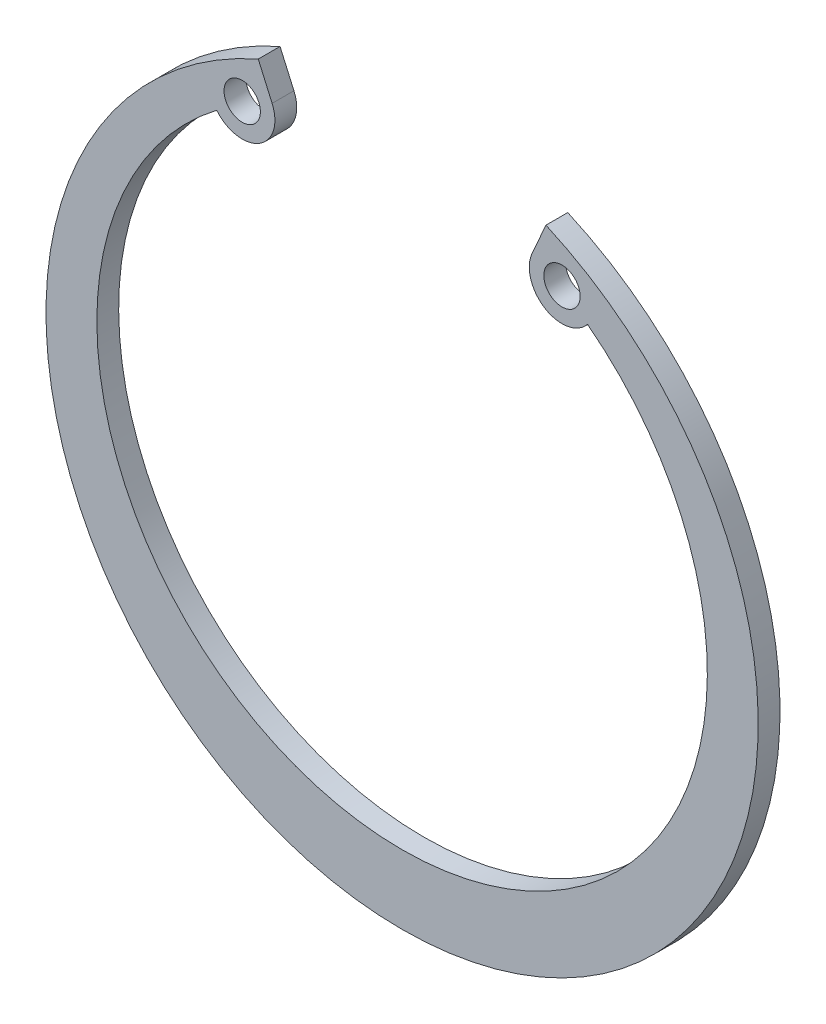
ISO-10303-21;
HEADER;
FILE_DESCRIPTION(('STEP AP214'),'2;1');
FILE_NAME('part.step','',(''),(''),'','','');
FILE_SCHEMA(('AUTOMOTIVE_DESIGN { 1 0 10303 214 1 1 1 1 }'));
ENDSEC;
DATA;
#1=APPLICATION_CONTEXT('core data for automotive mechanical design processes');
#2=APPLICATION_PROTOCOL_DEFINITION('international standard','automotive_design',2000,#1);
#3=PRODUCT_CONTEXT('',#1,'mechanical');
#4=PRODUCT('Part','Part','',(#3));
#5=PRODUCT_RELATED_PRODUCT_CATEGORY('part','',(#4));
#6=PRODUCT_DEFINITION_FORMATION('','',#4);
#7=PRODUCT_DEFINITION_CONTEXT('part definition',#1,'design');
#8=PRODUCT_DEFINITION('design','',#6,#7);
#9=PRODUCT_DEFINITION_SHAPE('','',#8);
#10=(LENGTH_UNIT() NAMED_UNIT(*) SI_UNIT(.MILLI.,.METRE.));
#11=(NAMED_UNIT(*) PLANE_ANGLE_UNIT() SI_UNIT($,.RADIAN.));
#12=(NAMED_UNIT(*) SI_UNIT($,.STERADIAN.) SOLID_ANGLE_UNIT());
#13=UNCERTAINTY_MEASURE_WITH_UNIT(LENGTH_MEASURE(1.E-05),#10,'distance_accuracy_value','');
#14=(GEOMETRIC_REPRESENTATION_CONTEXT(3) GLOBAL_UNCERTAINTY_ASSIGNED_CONTEXT((#13)) GLOBAL_UNIT_ASSIGNED_CONTEXT((#10,
#11,#12)) REPRESENTATION_CONTEXT('',''));
#15=CARTESIAN_POINT('',(0.,0.,0.));
#16=DIRECTION('',(0.,0.,1.));
#17=DIRECTION('',(1.,0.,0.));
#18=AXIS2_PLACEMENT_3D('',#15,#16,#17);
#19=CARTESIAN_POINT('',(-11.,19.3406954373414,1.5));
#20=DIRECTION('',(0.,0.,-1.));
#21=DIRECTION('',(-1.,0.,0.));
#22=AXIS2_PLACEMENT_3D('',#19,#20,#21);
#23=PLANE('',#22);
#24=CARTESIAN_POINT('',(11.,19.3406954373414,1.5));
#25=DIRECTION('',(0.,0.,1.));
#26=DIRECTION('',(1.,0.,0.));
#27=AXIS2_PLACEMENT_3D('',#24,#25,#26);
#28=CIRCLE('',#27,1.25);
#29=CARTESIAN_POINT('',(12.25,19.3406954373414,1.5));
#30=VERTEX_POINT('',#29);
#31=EDGE_CURVE('E422',#30,#30,#28,.T.);
#32=ORIENTED_EDGE('',*,*,#31,.F.);
#33=EDGE_LOOP('',(#32));
#34=FACE_BOUND('',#33,.T.);
#35=CARTESIAN_POINT('',(-11.,19.3406954373414,1.5));
#36=DIRECTION('',(0.,0.,1.));
#37=DIRECTION('',(-1.,0.,0.));
#38=AXIS2_PLACEMENT_3D('',#35,#36,#37);
#39=CIRCLE('',#38,2.25);
#40=CARTESIAN_POINT('',(-12.7549668879333,17.9326502597077,1.5));
#41=VERTEX_POINT('',#40);
#42=CARTESIAN_POINT('',(-8.94173922779528,20.2495752938699,1.5));
#43=VERTEX_POINT('',#42);
#44=EDGE_CURVE('E436',#41,#43,#39,.T.);
#45=ORIENTED_EDGE('',*,*,#44,.T.);
#46=DIRECTION('',(-0.403946602901547,0.91478256542432,0.));
#47=VECTOR('',#46,1.);
#48=CARTESIAN_POINT('',(-8.94173922779528,20.2495752938699,1.5));
#49=LINE('',#48,#47);
#50=CARTESIAN_POINT('',(-9.89669177108789,22.4121728528958,1.5));
#51=VERTEX_POINT('',#50);
#52=EDGE_CURVE('E417',#43,#51,#49,.T.);
#53=ORIENTED_EDGE('',*,*,#52,.T.);
#54=CARTESIAN_POINT('',(0.,0.,1.5));
#55=DIRECTION('',(0.,0.,1.));
#56=DIRECTION('',(1.,0.,0.));
#57=AXIS2_PLACEMENT_3D('',#54,#55,#56);
#58=CIRCLE('',#57,24.5);
#59=CARTESIAN_POINT('',(9.89669177108789,22.4121728528958,1.5));
#60=VERTEX_POINT('',#59);
#61=EDGE_CURVE('E439',#51,#60,#58,.T.);
#62=ORIENTED_EDGE('',*,*,#61,.T.);
#63=DIRECTION('',(-0.403946602901547,-0.91478256542432,0.));
#64=VECTOR('',#63,1.);
#65=CARTESIAN_POINT('',(8.94173922779528,20.2495752938699,1.5));
#66=LINE('',#65,#64);
#67=CARTESIAN_POINT('',(8.94173922779528,20.2495752938699,1.5));
#68=VERTEX_POINT('',#67);
#69=EDGE_CURVE('E441',#60,#68,#66,.T.);
#70=ORIENTED_EDGE('',*,*,#69,.T.);
#71=CARTESIAN_POINT('',(11.,19.3406954373414,1.5));
#72=DIRECTION('',(0.,0.,1.));
#73=DIRECTION('',(1.,0.,0.));
#74=AXIS2_PLACEMENT_3D('',#71,#72,#73);
#75=CIRCLE('',#74,2.25);
#76=CARTESIAN_POINT('',(12.7549668879333,17.9326502597077,1.5));
#77=VERTEX_POINT('',#76);
#78=EDGE_CURVE('E370',#68,#77,#75,.T.);
#79=ORIENTED_EDGE('',*,*,#78,.T.);
#80=CARTESIAN_POINT('',(0.,1.25,1.5));
#81=DIRECTION('',(0.,0.,-1.));
#82=DIRECTION('',(1.,0.,0.));
#83=AXIS2_PLACEMENT_3D('',#80,#81,#82);
#84=CIRCLE('',#83,21.);
#85=EDGE_CURVE('E365',#77,#41,#84,.T.);
#86=ORIENTED_EDGE('',*,*,#85,.T.);
#87=EDGE_LOOP('',(#45,#53,#62,#70,#79,#86));
#88=FACE_BOUND('',#87,.T.);
#89=CARTESIAN_POINT('',(-11.,19.3406954373414,1.5));
#90=DIRECTION('',(0.,0.,1.));
#91=DIRECTION('',(-1.,0.,0.));
#92=AXIS2_PLACEMENT_3D('',#89,#90,#91);
#93=CIRCLE('',#92,1.25);
#94=CARTESIAN_POINT('',(-12.25,19.3406954373414,1.5));
#95=VERTEX_POINT('',#94);
#96=EDGE_CURVE('E496',#95,#95,#93,.T.);
#97=ORIENTED_EDGE('',*,*,#96,.F.);
#98=EDGE_LOOP('',(#97));
#99=FACE_BOUND('',#98,.T.);
#100=ADVANCED_FACE('F350',(#34,#88,#99),#23,.F.);
#101=CARTESIAN_POINT('',(-11.,19.3406954373414,0.));
#102=DIRECTION('',(0.,0.,-1.));
#103=DIRECTION('',(-1.,0.,0.));
#104=AXIS2_PLACEMENT_3D('',#101,#102,#103);
#105=PLANE('',#104);
#106=CARTESIAN_POINT('',(11.,19.3406954373414,0.));
#107=DIRECTION('',(0.,0.,1.));
#108=DIRECTION('',(1.,0.,0.));
#109=AXIS2_PLACEMENT_3D('',#106,#107,#108);
#110=CIRCLE('',#109,1.25);
#111=CARTESIAN_POINT('',(12.25,19.3406954373414,0.));
#112=VERTEX_POINT('',#111);
#113=EDGE_CURVE('E425',#112,#112,#110,.T.);
#114=ORIENTED_EDGE('',*,*,#113,.T.);
#115=EDGE_LOOP('',(#114));
#116=FACE_BOUND('',#115,.T.);
#117=CARTESIAN_POINT('',(-11.,19.3406954373414,0.));
#118=DIRECTION('',(0.,0.,1.));
#119=DIRECTION('',(-1.,0.,0.));
#120=AXIS2_PLACEMENT_3D('',#117,#118,#119);
#121=CIRCLE('',#120,2.25);
#122=CARTESIAN_POINT('',(-12.7549668879333,17.9326502597077,0.));
#123=VERTEX_POINT('',#122);
#124=CARTESIAN_POINT('',(-8.94173922779528,20.2495752938699,0.));
#125=VERTEX_POINT('',#124);
#126=EDGE_CURVE('E408',#123,#125,#121,.T.);
#127=ORIENTED_EDGE('',*,*,#126,.F.);
#128=CARTESIAN_POINT('',(0.,1.25,0.));
#129=DIRECTION('',(0.,0.,-1.));
#130=DIRECTION('',(1.,0.,0.));
#131=AXIS2_PLACEMENT_3D('',#128,#129,#130);
#132=CIRCLE('',#131,21.);
#133=CARTESIAN_POINT('',(12.7549668879333,17.9326502597077,0.));
#134=VERTEX_POINT('',#133);
#135=EDGE_CURVE('E434',#134,#123,#132,.T.);
#136=ORIENTED_EDGE('',*,*,#135,.F.);
#137=CARTESIAN_POINT('',(11.,19.3406954373414,0.));
#138=DIRECTION('',(0.,0.,1.));
#139=DIRECTION('',(1.,0.,0.));
#140=AXIS2_PLACEMENT_3D('',#137,#138,#139);
#141=CIRCLE('',#140,2.25);
#142=CARTESIAN_POINT('',(8.94173922779528,20.2495752938699,0.));
#143=VERTEX_POINT('',#142);
#144=EDGE_CURVE('E432',#143,#134,#141,.T.);
#145=ORIENTED_EDGE('',*,*,#144,.F.);
#146=DIRECTION('',(-0.403946602901547,-0.91478256542432,0.));
#147=VECTOR('',#146,1.);
#148=CARTESIAN_POINT('',(8.94173922779528,20.2495752938699,0.));
#149=LINE('',#148,#147);
#150=CARTESIAN_POINT('',(9.89669177108789,22.4121728528958,0.));
#151=VERTEX_POINT('',#150);
#152=EDGE_CURVE('E430',#151,#143,#149,.T.);
#153=ORIENTED_EDGE('',*,*,#152,.F.);
#154=CARTESIAN_POINT('',(0.,0.,0.));
#155=DIRECTION('',(0.,0.,1.));
#156=DIRECTION('',(1.,0.,0.));
#157=AXIS2_PLACEMENT_3D('',#154,#155,#156);
#158=CIRCLE('',#157,24.5);
#159=CARTESIAN_POINT('',(-9.89669177108789,22.4121728528958,0.));
#160=VERTEX_POINT('',#159);
#161=EDGE_CURVE('E410',#160,#151,#158,.T.);
#162=ORIENTED_EDGE('',*,*,#161,.F.);
#163=DIRECTION('',(-0.403946602901547,0.91478256542432,0.));
#164=VECTOR('',#163,1.);
#165=CARTESIAN_POINT('',(-8.94173922779528,20.2495752938699,0.));
#166=LINE('',#165,#164);
#167=EDGE_CURVE('E403',#125,#160,#166,.T.);
#168=ORIENTED_EDGE('',*,*,#167,.F.);
#169=EDGE_LOOP('',(#127,#136,#145,#153,#162,#168));
#170=FACE_BOUND('',#169,.T.);
#171=CARTESIAN_POINT('',(-11.,19.3406954373414,0.));
#172=DIRECTION('',(0.,0.,1.));
#173=DIRECTION('',(-1.,0.,0.));
#174=AXIS2_PLACEMENT_3D('',#171,#172,#173);
#175=CIRCLE('',#174,1.25);
#176=CARTESIAN_POINT('',(-12.25,19.3406954373414,0.));
#177=VERTEX_POINT('',#176);
#178=EDGE_CURVE('E499',#177,#177,#175,.T.);
#179=ORIENTED_EDGE('',*,*,#178,.T.);
#180=EDGE_LOOP('',(#179));
#181=FACE_BOUND('',#180,.T.);
#182=ADVANCED_FACE('F404',(#116,#170,#181),#105,.T.);
#183=CARTESIAN_POINT('',(-11.,19.3406954373414,1.5));
#184=DIRECTION('',(0.,0.,-1.));
#185=DIRECTION('',(-1.,0.,0.));
#186=AXIS2_PLACEMENT_3D('',#183,#184,#185);
#187=CYLINDRICAL_SURFACE('',#186,2.25);
#188=ORIENTED_EDGE('',*,*,#126,.T.);
#189=DIRECTION('',(0.,0.,-1.));
#190=VECTOR('',#189,1.);
#191=CARTESIAN_POINT('',(-8.94173922779528,20.2495752938699,1.5));
#192=LINE('',#191,#190);
#193=EDGE_CURVE('E11',#43,#125,#192,.T.);
#194=ORIENTED_EDGE('',*,*,#193,.F.);
#195=ORIENTED_EDGE('',*,*,#44,.F.);
#196=DIRECTION('',(0.,0.,-1.));
#197=VECTOR('',#196,1.);
#198=CARTESIAN_POINT('',(-12.7549668879333,17.9326502597077,1.5));
#199=LINE('',#198,#197);
#200=EDGE_CURVE('E421',#41,#123,#199,.T.);
#201=ORIENTED_EDGE('',*,*,#200,.T.);
#202=EDGE_LOOP('',(#188,#194,#195,#201));
#203=FACE_BOUND('',#202,.T.);
#204=ADVANCED_FACE('F352',(#203),#187,.T.);
#205=CARTESIAN_POINT('',(-8.94173922779528,20.2495752938699,1.5));
#206=DIRECTION('',(-0.91478256542432,-0.403946602901547,0.));
#207=DIRECTION('',(0.403946602901547,-0.91478256542432,0.));
#208=AXIS2_PLACEMENT_3D('',#205,#206,#207);
#209=PLANE('',#208);
#210=ORIENTED_EDGE('',*,*,#167,.T.);
#211=DIRECTION('',(0.,0.,-1.));
#212=VECTOR('',#211,1.);
#213=CARTESIAN_POINT('',(-9.89669177108789,22.4121728528958,1.5));
#214=LINE('',#213,#212);
#215=EDGE_CURVE('E358',#51,#160,#214,.T.);
#216=ORIENTED_EDGE('',*,*,#215,.F.);
#217=ORIENTED_EDGE('',*,*,#52,.F.);
#218=ORIENTED_EDGE('',*,*,#193,.T.);
#219=EDGE_LOOP('',(#210,#216,#217,#218));
#220=FACE_BOUND('',#219,.T.);
#221=ADVANCED_FACE('F416',(#220),#209,.F.);
#222=CARTESIAN_POINT('',(0.,0.,1.5));
#223=DIRECTION('',(0.,0.,-1.));
#224=DIRECTION('',(-1.,0.,0.));
#225=AXIS2_PLACEMENT_3D('',#222,#223,#224);
#226=CYLINDRICAL_SURFACE('',#225,24.5);
#227=ORIENTED_EDGE('',*,*,#161,.T.);
#228=DIRECTION('',(0.,0.,-1.));
#229=VECTOR('',#228,1.);
#230=CARTESIAN_POINT('',(9.89669177108789,22.4121728528958,1.5));
#231=LINE('',#230,#229);
#232=EDGE_CURVE('E452',#60,#151,#231,.T.);
#233=ORIENTED_EDGE('',*,*,#232,.F.);
#234=ORIENTED_EDGE('',*,*,#61,.F.);
#235=ORIENTED_EDGE('',*,*,#215,.T.);
#236=EDGE_LOOP('',(#227,#233,#234,#235));
#237=FACE_BOUND('',#236,.T.);
#238=ADVANCED_FACE('F456',(#237),#226,.T.);
#239=CARTESIAN_POINT('',(8.94173922779528,20.2495752938699,1.5));
#240=DIRECTION('',(0.91478256542432,-0.403946602901547,0.));
#241=DIRECTION('',(0.403946602901547,0.91478256542432,0.));
#242=AXIS2_PLACEMENT_3D('',#239,#240,#241);
#243=PLANE('',#242);
#244=ORIENTED_EDGE('',*,*,#152,.T.);
#245=DIRECTION('',(0.,0.,-1.));
#246=VECTOR('',#245,1.);
#247=CARTESIAN_POINT('',(8.94173922779528,20.2495752938699,1.5));
#248=LINE('',#247,#246);
#249=EDGE_CURVE('E449',#68,#143,#248,.T.);
#250=ORIENTED_EDGE('',*,*,#249,.F.);
#251=ORIENTED_EDGE('',*,*,#69,.F.);
#252=ORIENTED_EDGE('',*,*,#232,.T.);
#253=EDGE_LOOP('',(#244,#250,#251,#252));
#254=FACE_BOUND('',#253,.T.);
#255=ADVANCED_FACE('F462',(#254),#243,.F.);
#256=CARTESIAN_POINT('',(11.,19.3406954373414,1.5));
#257=DIRECTION('',(0.,0.,-1.));
#258=DIRECTION('',(-1.,0.,0.));
#259=AXIS2_PLACEMENT_3D('',#256,#257,#258);
#260=CYLINDRICAL_SURFACE('',#259,2.25);
#261=ORIENTED_EDGE('',*,*,#144,.T.);
#262=DIRECTION('',(0.,0.,-1.));
#263=VECTOR('',#262,1.);
#264=CARTESIAN_POINT('',(12.7549668879333,17.9326502597077,1.5));
#265=LINE('',#264,#263);
#266=EDGE_CURVE('E446',#77,#134,#265,.T.);
#267=ORIENTED_EDGE('',*,*,#266,.F.);
#268=ORIENTED_EDGE('',*,*,#78,.F.);
#269=ORIENTED_EDGE('',*,*,#249,.T.);
#270=EDGE_LOOP('',(#261,#267,#268,#269));
#271=FACE_BOUND('',#270,.T.);
#272=ADVANCED_FACE('F465',(#271),#260,.T.);
#273=CARTESIAN_POINT('',(0.,1.25,1.5));
#274=DIRECTION('',(0.,0.,-1.));
#275=DIRECTION('',(-1.,0.,0.));
#276=AXIS2_PLACEMENT_3D('',#273,#274,#275);
#277=CYLINDRICAL_SURFACE('',#276,21.);
#278=ORIENTED_EDGE('',*,*,#135,.T.);
#279=ORIENTED_EDGE('',*,*,#200,.F.);
#280=ORIENTED_EDGE('',*,*,#85,.F.);
#281=ORIENTED_EDGE('',*,*,#266,.T.);
#282=EDGE_LOOP('',(#278,#279,#280,#281));
#283=FACE_BOUND('',#282,.T.);
#284=ADVANCED_FACE('F467',(#283),#277,.F.);
#285=CARTESIAN_POINT('',(11.,19.3406954373414,1.5));
#286=DIRECTION('',(0.,0.,-1.));
#287=DIRECTION('',(-1.,0.,0.));
#288=AXIS2_PLACEMENT_3D('',#285,#286,#287);
#289=CYLINDRICAL_SURFACE('',#288,1.25);
#290=ORIENTED_EDGE('',*,*,#31,.T.);
#291=EDGE_LOOP('',(#290));
#292=FACE_BOUND('',#291,.T.);
#293=ORIENTED_EDGE('',*,*,#113,.F.);
#294=EDGE_LOOP('',(#293));
#295=FACE_BOUND('',#294,.T.);
#296=ADVANCED_FACE('F469',(#292,#295),#289,.F.);
#297=CARTESIAN_POINT('',(-11.,19.3406954373414,1.5));
#298=DIRECTION('',(0.,0.,-1.));
#299=DIRECTION('',(-1.,0.,0.));
#300=AXIS2_PLACEMENT_3D('',#297,#298,#299);
#301=CYLINDRICAL_SURFACE('',#300,1.25);
#302=ORIENTED_EDGE('',*,*,#96,.T.);
#303=EDGE_LOOP('',(#302));
#304=FACE_BOUND('',#303,.T.);
#305=ORIENTED_EDGE('',*,*,#178,.F.);
#306=EDGE_LOOP('',(#305));
#307=FACE_BOUND('',#306,.T.);
#308=ADVANCED_FACE('F475',(#304,#307),#301,.F.);
#309=CLOSED_SHELL('',(#100,#182,#204,#221,#238,#255,#272,#284,#296,#308));
#310=MANIFOLD_SOLID_BREP('B2',#309);
#311=ADVANCED_BREP_SHAPE_REPRESENTATION('',(#18,#310),#14);
#312=SHAPE_DEFINITION_REPRESENTATION(#9,#311);
ENDSEC;
END-ISO-10303-21;
